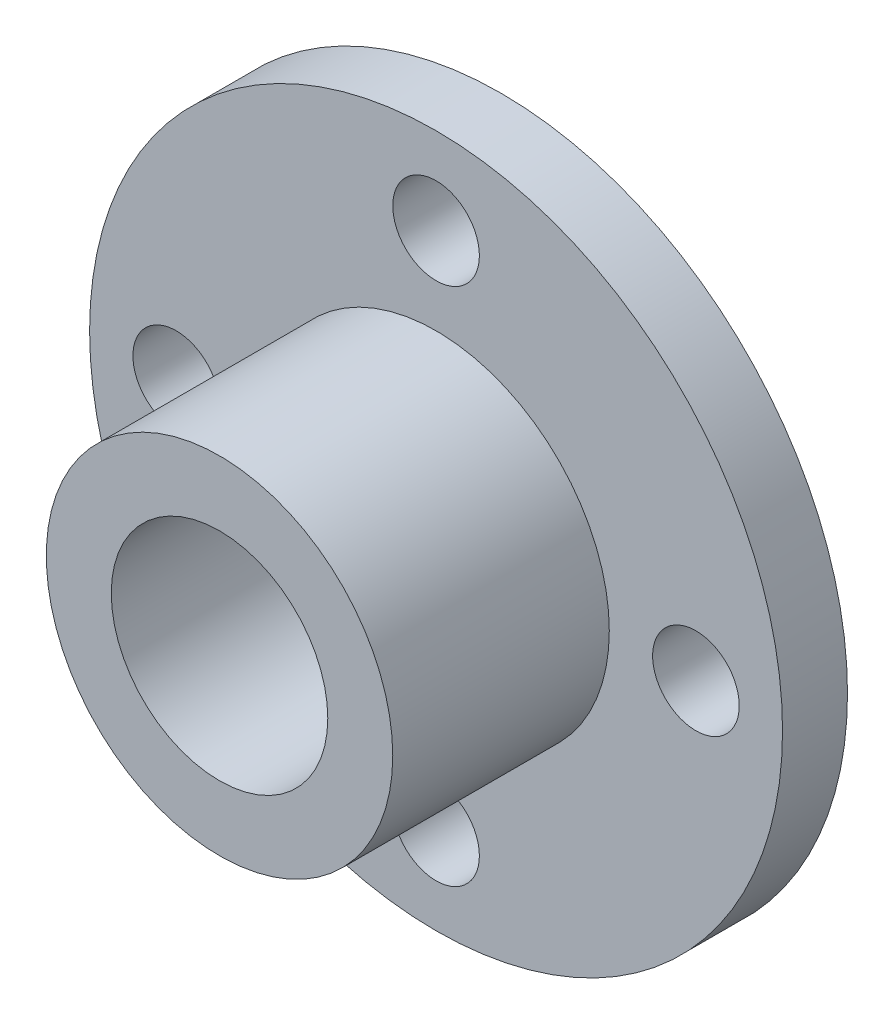
ISO-10303-21;
HEADER;
FILE_DESCRIPTION(('STEP AP214'),'2;1');
FILE_NAME('part.step','',(''),(''),'','','');
FILE_SCHEMA(('AUTOMOTIVE_DESIGN { 1 0 10303 214 1 1 1 1 }'));
ENDSEC;
DATA;
#1=APPLICATION_CONTEXT('core data for automotive mechanical design processes');
#2=APPLICATION_PROTOCOL_DEFINITION('international standard','automotive_design',2000,#1);
#3=PRODUCT_CONTEXT('',#1,'mechanical');
#4=PRODUCT('Part','Part','',(#3));
#5=PRODUCT_RELATED_PRODUCT_CATEGORY('part','',(#4));
#6=PRODUCT_DEFINITION_FORMATION('','',#4);
#7=PRODUCT_DEFINITION_CONTEXT('part definition',#1,'design');
#8=PRODUCT_DEFINITION('design','',#6,#7);
#9=PRODUCT_DEFINITION_SHAPE('','',#8);
#10=(LENGTH_UNIT() NAMED_UNIT(*) SI_UNIT(.MILLI.,.METRE.));
#11=(NAMED_UNIT(*) PLANE_ANGLE_UNIT() SI_UNIT($,.RADIAN.));
#12=(NAMED_UNIT(*) SI_UNIT($,.STERADIAN.) SOLID_ANGLE_UNIT());
#13=UNCERTAINTY_MEASURE_WITH_UNIT(LENGTH_MEASURE(1.E-05),#10,'distance_accuracy_value','');
#14=(GEOMETRIC_REPRESENTATION_CONTEXT(3) GLOBAL_UNCERTAINTY_ASSIGNED_CONTEXT((#13)) GLOBAL_UNIT_ASSIGNED_CONTEXT((#10,
#11,#12)) REPRESENTATION_CONTEXT('',''));
#15=CARTESIAN_POINT('',(0.,0.,0.));
#16=DIRECTION('',(0.,0.,1.));
#17=DIRECTION('',(1.,0.,0.));
#18=AXIS2_PLACEMENT_3D('',#15,#16,#17);
#19=CARTESIAN_POINT('',(0.,0.,3.));
#20=DIRECTION('',(0.,0.,-1.));
#21=DIRECTION('',(-1.,0.,0.));
#22=AXIS2_PLACEMENT_3D('',#19,#20,#21);
#23=CYLINDRICAL_SURFACE('',#22,16.);
#24=CARTESIAN_POINT('',(0.,0.,3.));
#25=DIRECTION('',(0.,0.,1.));
#26=DIRECTION('',(1.,0.,0.));
#27=AXIS2_PLACEMENT_3D('',#24,#25,#26);
#28=CIRCLE('',#27,16.);
#29=CARTESIAN_POINT('',(16.,0.,3.));
#30=VERTEX_POINT('',#29);
#31=EDGE_CURVE('E51',#30,#30,#28,.T.);
#32=ORIENTED_EDGE('',*,*,#31,.F.);
#33=EDGE_LOOP('',(#32));
#34=FACE_BOUND('',#33,.T.);
#35=CARTESIAN_POINT('',(0.,0.,0.));
#36=DIRECTION('',(0.,0.,1.));
#37=DIRECTION('',(1.,0.,0.));
#38=AXIS2_PLACEMENT_3D('',#35,#36,#37);
#39=CIRCLE('',#38,16.);
#40=CARTESIAN_POINT('',(16.,0.,0.));
#41=VERTEX_POINT('',#40);
#42=EDGE_CURVE('E46',#41,#41,#39,.T.);
#43=ORIENTED_EDGE('',*,*,#42,.T.);
#44=EDGE_LOOP('',(#43));
#45=FACE_BOUND('',#44,.T.);
#46=ADVANCED_FACE('F43',(#34,#45),#23,.T.);
#47=CARTESIAN_POINT('',(0.,0.,3.));
#48=DIRECTION('',(0.,0.,1.));
#49=DIRECTION('',(1.,0.,0.));
#50=AXIS2_PLACEMENT_3D('',#47,#48,#49);
#51=PLANE('',#50);
#52=CARTESIAN_POINT('',(0.,12.,3.));
#53=DIRECTION('',(0.,0.,1.));
#54=DIRECTION('',(1.,0.,0.));
#55=AXIS2_PLACEMENT_3D('',#52,#53,#54);
#56=CIRCLE('',#55,2.);
#57=CARTESIAN_POINT('',(2.,12.,3.));
#58=VERTEX_POINT('',#57);
#59=EDGE_CURVE('E70',#58,#58,#56,.F.);
#60=ORIENTED_EDGE('',*,*,#59,.T.);
#61=EDGE_LOOP('',(#60));
#62=FACE_BOUND('',#61,.T.);
#63=CARTESIAN_POINT('',(12.,0.,3.));
#64=DIRECTION('',(0.,0.,1.));
#65=DIRECTION('',(1.,0.,0.));
#66=AXIS2_PLACEMENT_3D('',#63,#64,#65);
#67=CIRCLE('',#66,2.);
#68=CARTESIAN_POINT('',(14.,0.,3.));
#69=VERTEX_POINT('',#68);
#70=EDGE_CURVE('E75',#69,#69,#67,.F.);
#71=ORIENTED_EDGE('',*,*,#70,.T.);
#72=EDGE_LOOP('',(#71));
#73=FACE_BOUND('',#72,.T.);
#74=CARTESIAN_POINT('',(0.,-12.,3.));
#75=DIRECTION('',(0.,0.,1.));
#76=DIRECTION('',(1.,0.,0.));
#77=AXIS2_PLACEMENT_3D('',#74,#75,#76);
#78=CIRCLE('',#77,2.);
#79=CARTESIAN_POINT('',(1.99999999999992,-12.,3.));
#80=VERTEX_POINT('',#79);
#81=EDGE_CURVE('E76',#80,#80,#78,.F.);
#82=ORIENTED_EDGE('',*,*,#81,.T.);
#83=EDGE_LOOP('',(#82));
#84=FACE_BOUND('',#83,.T.);
#85=CARTESIAN_POINT('',(-12.,1.25693328198353E-13,3.));
#86=DIRECTION('',(0.,0.,1.));
#87=DIRECTION('',(1.,0.,0.));
#88=AXIS2_PLACEMENT_3D('',#85,#86,#87);
#89=CIRCLE('',#88,2.);
#90=CARTESIAN_POINT('',(-10.,1.25693328198353E-13,3.));
#91=VERTEX_POINT('',#90);
#92=EDGE_CURVE('E91',#91,#91,#89,.F.);
#93=ORIENTED_EDGE('',*,*,#92,.T.);
#94=EDGE_LOOP('',(#93));
#95=FACE_BOUND('',#94,.T.);
#96=CARTESIAN_POINT('',(0.,0.,3.));
#97=DIRECTION('',(0.,0.,1.));
#98=DIRECTION('',(1.,0.,0.));
#99=AXIS2_PLACEMENT_3D('',#96,#97,#98);
#100=CIRCLE('',#99,8.);
#101=CARTESIAN_POINT('',(8.,0.,3.));
#102=VERTEX_POINT('',#101);
#103=EDGE_CURVE('E10',#102,#102,#100,.T.);
#104=ORIENTED_EDGE('',*,*,#103,.F.);
#105=EDGE_LOOP('',(#104));
#106=FACE_BOUND('',#105,.T.);
#107=ORIENTED_EDGE('',*,*,#31,.T.);
#108=EDGE_LOOP('',(#107));
#109=FACE_BOUND('',#108,.T.);
#110=ADVANCED_FACE('F103',(#62,#73,#84,#95,#106,#109),#51,.T.);
#111=CARTESIAN_POINT('',(0.,0.,0.));
#112=DIRECTION('',(0.,0.,1.));
#113=DIRECTION('',(1.,0.,0.));
#114=AXIS2_PLACEMENT_3D('',#111,#112,#113);
#115=PLANE('',#114);
#116=CARTESIAN_POINT('',(0.,12.,0.));
#117=DIRECTION('',(0.,0.,1.));
#118=DIRECTION('',(1.,0.,0.));
#119=AXIS2_PLACEMENT_3D('',#116,#117,#118);
#120=CIRCLE('',#119,2.);
#121=CARTESIAN_POINT('',(2.,12.,0.));
#122=VERTEX_POINT('',#121);
#123=EDGE_CURVE('E80',#122,#122,#120,.F.);
#124=ORIENTED_EDGE('',*,*,#123,.F.);
#125=EDGE_LOOP('',(#124));
#126=FACE_BOUND('',#125,.T.);
#127=CARTESIAN_POINT('',(12.,0.,0.));
#128=DIRECTION('',(0.,0.,1.));
#129=DIRECTION('',(1.,0.,0.));
#130=AXIS2_PLACEMENT_3D('',#127,#128,#129);
#131=CIRCLE('',#130,2.);
#132=CARTESIAN_POINT('',(14.,0.,0.));
#133=VERTEX_POINT('',#132);
#134=EDGE_CURVE('E71',#133,#133,#131,.F.);
#135=ORIENTED_EDGE('',*,*,#134,.F.);
#136=EDGE_LOOP('',(#135));
#137=FACE_BOUND('',#136,.T.);
#138=CARTESIAN_POINT('',(0.,-12.,0.));
#139=DIRECTION('',(0.,0.,1.));
#140=DIRECTION('',(1.,0.,0.));
#141=AXIS2_PLACEMENT_3D('',#138,#139,#140);
#142=CIRCLE('',#141,2.);
#143=CARTESIAN_POINT('',(1.99999999999992,-12.,0.));
#144=VERTEX_POINT('',#143);
#145=EDGE_CURVE('E95',#144,#144,#142,.F.);
#146=ORIENTED_EDGE('',*,*,#145,.F.);
#147=EDGE_LOOP('',(#146));
#148=FACE_BOUND('',#147,.T.);
#149=CARTESIAN_POINT('',(-12.,1.25693328198353E-13,0.));
#150=DIRECTION('',(0.,0.,1.));
#151=DIRECTION('',(1.,0.,0.));
#152=AXIS2_PLACEMENT_3D('',#149,#150,#151);
#153=CIRCLE('',#152,2.);
#154=CARTESIAN_POINT('',(-10.,1.25693328198353E-13,0.));
#155=VERTEX_POINT('',#154);
#156=EDGE_CURVE('E87',#155,#155,#153,.F.);
#157=ORIENTED_EDGE('',*,*,#156,.F.);
#158=EDGE_LOOP('',(#157));
#159=FACE_BOUND('',#158,.T.);
#160=CARTESIAN_POINT('',(0.,0.,0.));
#161=DIRECTION('',(0.,0.,1.));
#162=DIRECTION('',(1.,0.,0.));
#163=AXIS2_PLACEMENT_3D('',#160,#161,#162);
#164=CIRCLE('',#163,5.);
#165=CARTESIAN_POINT('',(5.,0.,0.));
#166=VERTEX_POINT('',#165);
#167=EDGE_CURVE('E62',#166,#166,#164,.F.);
#168=ORIENTED_EDGE('',*,*,#167,.F.);
#169=EDGE_LOOP('',(#168));
#170=FACE_BOUND('',#169,.T.);
#171=ORIENTED_EDGE('',*,*,#42,.F.);
#172=EDGE_LOOP('',(#171));
#173=FACE_BOUND('',#172,.T.);
#174=ADVANCED_FACE('F114',(#126,#137,#148,#159,#170,#173),#115,.F.);
#175=CARTESIAN_POINT('',(0.,0.,13.));
#176=DIRECTION('',(0.,0.,-1.));
#177=DIRECTION('',(-1.,0.,0.));
#178=AXIS2_PLACEMENT_3D('',#175,#176,#177);
#179=CYLINDRICAL_SURFACE('',#178,8.);
#180=CARTESIAN_POINT('',(0.,0.,13.));
#181=DIRECTION('',(0.,0.,1.));
#182=DIRECTION('',(1.,0.,0.));
#183=AXIS2_PLACEMENT_3D('',#180,#181,#182);
#184=CIRCLE('',#183,8.);
#185=CARTESIAN_POINT('',(8.,0.,13.));
#186=VERTEX_POINT('',#185);
#187=EDGE_CURVE('E58',#186,#186,#184,.T.);
#188=ORIENTED_EDGE('',*,*,#187,.F.);
#189=EDGE_LOOP('',(#188));
#190=FACE_BOUND('',#189,.T.);
#191=ORIENTED_EDGE('',*,*,#103,.T.);
#192=EDGE_LOOP('',(#191));
#193=FACE_BOUND('',#192,.T.);
#194=ADVANCED_FACE('F117',(#190,#193),#179,.T.);
#195=CARTESIAN_POINT('',(0.,0.,13.));
#196=DIRECTION('',(0.,0.,1.));
#197=DIRECTION('',(1.,0.,0.));
#198=AXIS2_PLACEMENT_3D('',#195,#196,#197);
#199=PLANE('',#198);
#200=CARTESIAN_POINT('',(0.,0.,13.));
#201=DIRECTION('',(0.,0.,1.));
#202=DIRECTION('',(1.,0.,0.));
#203=AXIS2_PLACEMENT_3D('',#200,#201,#202);
#204=CIRCLE('',#203,5.);
#205=CARTESIAN_POINT('',(5.,0.,13.));
#206=VERTEX_POINT('',#205);
#207=EDGE_CURVE('E66',#206,#206,#204,.T.);
#208=ORIENTED_EDGE('',*,*,#207,.F.);
#209=EDGE_LOOP('',(#208));
#210=FACE_BOUND('',#209,.T.);
#211=ORIENTED_EDGE('',*,*,#187,.T.);
#212=EDGE_LOOP('',(#211));
#213=FACE_BOUND('',#212,.T.);
#214=ADVANCED_FACE('F142',(#210,#213),#199,.T.);
#215=CARTESIAN_POINT('',(0.,0.,-0.000999999999999265));
#216=DIRECTION('',(0.,0.,1.));
#217=DIRECTION('',(1.,0.,0.));
#218=AXIS2_PLACEMENT_3D('',#215,#216,#217);
#219=CYLINDRICAL_SURFACE('',#218,5.);
#220=ORIENTED_EDGE('',*,*,#207,.T.);
#221=EDGE_LOOP('',(#220));
#222=FACE_BOUND('',#221,.T.);
#223=ORIENTED_EDGE('',*,*,#167,.T.);
#224=EDGE_LOOP('',(#223));
#225=FACE_BOUND('',#224,.T.);
#226=ADVANCED_FACE('F146',(#222,#225),#219,.F.);
#227=CARTESIAN_POINT('',(-12.,1.25693328198353E-13,-0.000999999999999265));
#228=DIRECTION('',(0.,0.,1.));
#229=DIRECTION('',(1.,0.,0.));
#230=AXIS2_PLACEMENT_3D('',#227,#228,#229);
#231=CYLINDRICAL_SURFACE('',#230,2.);
#232=ORIENTED_EDGE('',*,*,#92,.F.);
#233=EDGE_LOOP('',(#232));
#234=FACE_BOUND('',#233,.T.);
#235=ORIENTED_EDGE('',*,*,#156,.T.);
#236=EDGE_LOOP('',(#235));
#237=FACE_BOUND('',#236,.T.);
#238=ADVANCED_FACE('F110',(#234,#237),#231,.F.);
#239=CARTESIAN_POINT('',(0.,-12.,-0.000999999999999265));
#240=DIRECTION('',(0.,0.,1.));
#241=DIRECTION('',(1.,0.,0.));
#242=AXIS2_PLACEMENT_3D('',#239,#240,#241);
#243=CYLINDRICAL_SURFACE('',#242,2.);
#244=ORIENTED_EDGE('',*,*,#81,.F.);
#245=EDGE_LOOP('',(#244));
#246=FACE_BOUND('',#245,.T.);
#247=ORIENTED_EDGE('',*,*,#145,.T.);
#248=EDGE_LOOP('',(#247));
#249=FACE_BOUND('',#248,.T.);
#250=ADVANCED_FACE('F106',(#246,#249),#243,.F.);
#251=CARTESIAN_POINT('',(12.,0.,-0.000999999999999265));
#252=DIRECTION('',(0.,0.,1.));
#253=DIRECTION('',(1.,0.,0.));
#254=AXIS2_PLACEMENT_3D('',#251,#252,#253);
#255=CYLINDRICAL_SURFACE('',#254,2.);
#256=ORIENTED_EDGE('',*,*,#70,.F.);
#257=EDGE_LOOP('',(#256));
#258=FACE_BOUND('',#257,.T.);
#259=ORIENTED_EDGE('',*,*,#134,.T.);
#260=EDGE_LOOP('',(#259));
#261=FACE_BOUND('',#260,.T.);
#262=ADVANCED_FACE('F109',(#258,#261),#255,.F.);
#263=CARTESIAN_POINT('',(0.,12.,-0.000999999999999265));
#264=DIRECTION('',(0.,0.,1.));
#265=DIRECTION('',(1.,0.,0.));
#266=AXIS2_PLACEMENT_3D('',#263,#264,#265);
#267=CYLINDRICAL_SURFACE('',#266,2.);
#268=ORIENTED_EDGE('',*,*,#59,.F.);
#269=EDGE_LOOP('',(#268));
#270=FACE_BOUND('',#269,.T.);
#271=ORIENTED_EDGE('',*,*,#123,.T.);
#272=EDGE_LOOP('',(#271));
#273=FACE_BOUND('',#272,.T.);
#274=ADVANCED_FACE('F153',(#270,#273),#267,.F.);
#275=CLOSED_SHELL('',(#46,#110,#174,#194,#214,#226,#238,#250,#262,#274));
#276=MANIFOLD_SOLID_BREP('B2',#275);
#277=ADVANCED_BREP_SHAPE_REPRESENTATION('',(#18,#276),#14);
#278=SHAPE_DEFINITION_REPRESENTATION(#9,#277);
ENDSEC;
END-ISO-10303-21;
